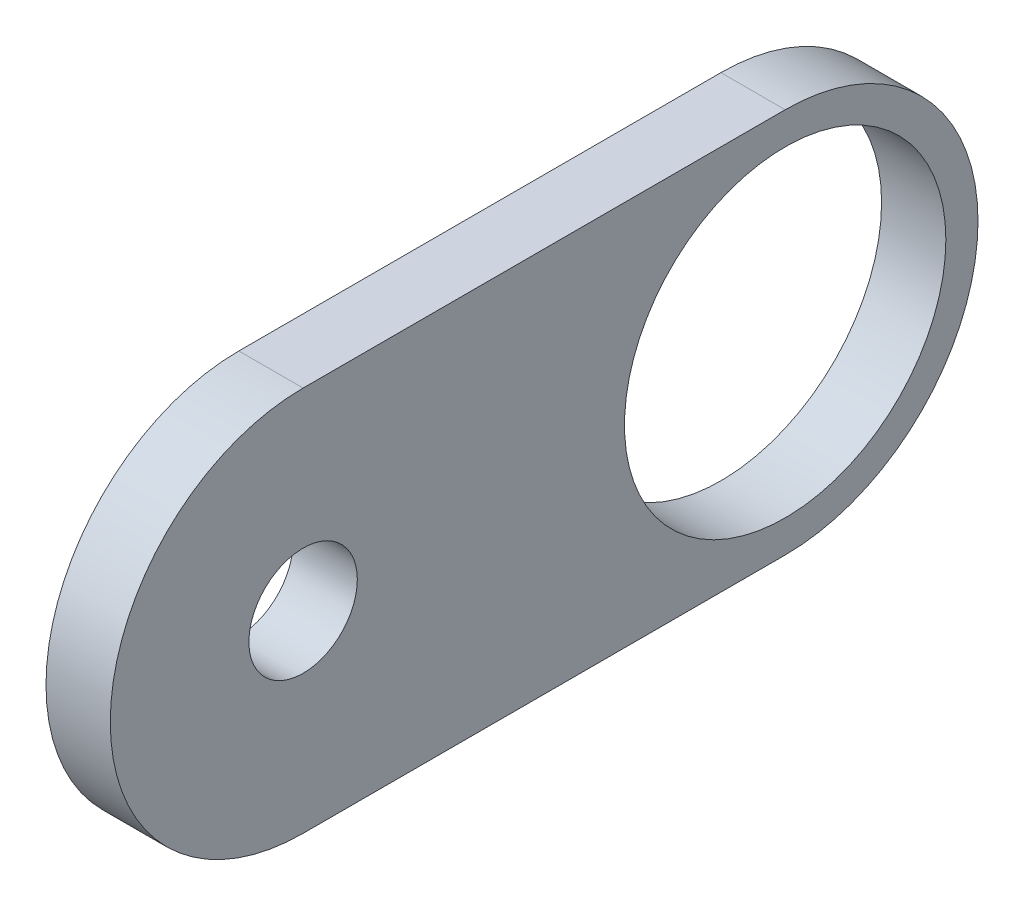
ISO-10303-21;
HEADER;
FILE_DESCRIPTION(('STEP AP214'),'2;1');
FILE_NAME('part.step','',(''),(''),'','','');
FILE_SCHEMA(('AUTOMOTIVE_DESIGN { 1 0 10303 214 1 1 1 1 }'));
ENDSEC;
DATA;
#1=APPLICATION_CONTEXT('core data for automotive mechanical design processes');
#2=APPLICATION_PROTOCOL_DEFINITION('international standard','automotive_design',2000,#1);
#3=PRODUCT_CONTEXT('',#1,'mechanical');
#4=PRODUCT('Part','Part','',(#3));
#5=PRODUCT_RELATED_PRODUCT_CATEGORY('part','',(#4));
#6=PRODUCT_DEFINITION_FORMATION('','',#4);
#7=PRODUCT_DEFINITION_CONTEXT('part definition',#1,'design');
#8=PRODUCT_DEFINITION('design','',#6,#7);
#9=PRODUCT_DEFINITION_SHAPE('','',#8);
#10=(LENGTH_UNIT() NAMED_UNIT(*) SI_UNIT(.MILLI.,.METRE.));
#11=(NAMED_UNIT(*) PLANE_ANGLE_UNIT() SI_UNIT($,.RADIAN.));
#12=(NAMED_UNIT(*) SI_UNIT($,.STERADIAN.) SOLID_ANGLE_UNIT());
#13=UNCERTAINTY_MEASURE_WITH_UNIT(LENGTH_MEASURE(1.E-05),#10,'distance_accuracy_value','');
#14=(GEOMETRIC_REPRESENTATION_CONTEXT(3) GLOBAL_UNCERTAINTY_ASSIGNED_CONTEXT((#13)) GLOBAL_UNIT_ASSIGNED_CONTEXT((#10,
#11,#12)) REPRESENTATION_CONTEXT('',''));
#15=CARTESIAN_POINT('',(0.,0.,0.));
#16=DIRECTION('',(0.,0.,1.));
#17=DIRECTION('',(1.,0.,0.));
#18=AXIS2_PLACEMENT_3D('',#15,#16,#17);
#19=CARTESIAN_POINT('',(5.0799999746,-45.6336193705345,15.3619127645357));
#20=DIRECTION('',(-1.,0.,0.));
#21=DIRECTION('',(0.,0.,1.));
#22=AXIS2_PLACEMENT_3D('',#19,#20,#21);
#23=PLANE('',#22);
#24=CARTESIAN_POINT('',(5.0799999746,-45.6336193705345,15.3619127645357));
#25=DIRECTION('',(1.,0.,0.));
#26=DIRECTION('',(0.,0.,1.));
#27=AXIS2_PLACEMENT_3D('',#24,#25,#26);
#28=CIRCLE('',#27,15.24);
#29=CARTESIAN_POINT('',(5.0799999746,-30.3936193705345,15.3619127645357));
#30=VERTEX_POINT('',#29);
#31=CARTESIAN_POINT('',(5.0799999746,-60.8736193705345,15.3619127645357));
#32=VERTEX_POINT('',#31);
#33=EDGE_CURVE('E91',#30,#32,#28,.T.);
#34=ORIENTED_EDGE('',*,*,#33,.T.);
#35=DIRECTION('',(0.,0.,-1.));
#36=VECTOR('',#35,1.);
#37=CARTESIAN_POINT('',(5.0799999746,-60.8736193705345,15.3619127645357));
#38=LINE('',#37,#36);
#39=CARTESIAN_POINT('',(5.0799999746,-60.8736193705345,-22.7380872354643));
#40=VERTEX_POINT('',#39);
#41=EDGE_CURVE('E86',#32,#40,#38,.T.);
#42=ORIENTED_EDGE('',*,*,#41,.T.);
#43=CARTESIAN_POINT('',(5.0799999746,-45.6336193705345,-22.7380872354643));
#44=DIRECTION('',(1.,0.,0.));
#45=DIRECTION('',(0.,0.,-1.));
#46=AXIS2_PLACEMENT_3D('',#43,#44,#45);
#47=CIRCLE('',#46,15.24);
#48=CARTESIAN_POINT('',(5.0799999746,-30.3936193705345,-22.7380872354643));
#49=VERTEX_POINT('',#48);
#50=EDGE_CURVE('E87',#40,#49,#47,.T.);
#51=ORIENTED_EDGE('',*,*,#50,.T.);
#52=DIRECTION('',(0.,0.,1.));
#53=VECTOR('',#52,1.);
#54=CARTESIAN_POINT('',(5.0799999746,-30.3936193705345,-22.7380872354643));
#55=LINE('',#54,#53);
#56=EDGE_CURVE('E57',#49,#30,#55,.T.);
#57=ORIENTED_EDGE('',*,*,#56,.T.);
#58=EDGE_LOOP('',(#34,#42,#51,#57));
#59=FACE_BOUND('',#58,.T.);
#60=CARTESIAN_POINT('',(5.0799999746,-45.6336193705345,-22.7380872354643));
#61=DIRECTION('',(1.,0.,0.));
#62=DIRECTION('',(0.,0.,-1.));
#63=AXIS2_PLACEMENT_3D('',#60,#61,#62);
#64=CIRCLE('',#63,12.7);
#65=CARTESIAN_POINT('',(5.0799999746,-45.6336193705345,-35.4380872354643));
#66=VERTEX_POINT('',#65);
#67=EDGE_CURVE('E107',#66,#66,#64,.T.);
#68=ORIENTED_EDGE('',*,*,#67,.F.);
#69=EDGE_LOOP('',(#68));
#70=FACE_BOUND('',#69,.T.);
#71=CARTESIAN_POINT('',(5.0799999746,-45.6336193705345,15.3619127645357));
#72=DIRECTION('',(1.,0.,0.));
#73=DIRECTION('',(0.,0.,-1.));
#74=AXIS2_PLACEMENT_3D('',#71,#72,#73);
#75=CIRCLE('',#74,4.28498);
#76=CARTESIAN_POINT('',(5.0799999746,-45.6336193705345,11.0769327645357));
#77=VERTEX_POINT('',#76);
#78=EDGE_CURVE('E123',#77,#77,#75,.T.);
#79=ORIENTED_EDGE('',*,*,#78,.F.);
#80=EDGE_LOOP('',(#79));
#81=FACE_BOUND('',#80,.T.);
#82=ADVANCED_FACE('F39',(#59,#70,#81),#23,.F.);
#83=CARTESIAN_POINT('',(0.,-45.6336193705345,15.3619127645357));
#84=DIRECTION('',(-1.,0.,0.));
#85=DIRECTION('',(0.,0.,1.));
#86=AXIS2_PLACEMENT_3D('',#83,#84,#85);
#87=PLANE('',#86);
#88=CARTESIAN_POINT('',(0.,-45.6336193705345,-22.7380872354643));
#89=DIRECTION('',(1.,0.,0.));
#90=DIRECTION('',(0.,0.,-1.));
#91=AXIS2_PLACEMENT_3D('',#88,#89,#90);
#92=CIRCLE('',#91,12.7);
#93=CARTESIAN_POINT('',(0.,-45.6336193705345,-35.4380872354643));
#94=VERTEX_POINT('',#93);
#95=EDGE_CURVE('E118',#94,#94,#92,.T.);
#96=ORIENTED_EDGE('',*,*,#95,.T.);
#97=EDGE_LOOP('',(#96));
#98=FACE_BOUND('',#97,.T.);
#99=CARTESIAN_POINT('',(0.,-45.6336193705345,15.3619127645357));
#100=DIRECTION('',(1.,0.,0.));
#101=DIRECTION('',(0.,0.,1.));
#102=AXIS2_PLACEMENT_3D('',#99,#100,#101);
#103=CIRCLE('',#102,15.24);
#104=CARTESIAN_POINT('',(0.,-30.3936193705345,15.3619127645357));
#105=VERTEX_POINT('',#104);
#106=CARTESIAN_POINT('',(0.,-60.8736193705345,15.3619127645357));
#107=VERTEX_POINT('',#106);
#108=EDGE_CURVE('E104',#105,#107,#103,.T.);
#109=ORIENTED_EDGE('',*,*,#108,.F.);
#110=DIRECTION('',(0.,0.,1.));
#111=VECTOR('',#110,1.);
#112=CARTESIAN_POINT('',(0.,-30.3936193705345,-22.7380872354643));
#113=LINE('',#112,#111);
#114=CARTESIAN_POINT('',(0.,-30.3936193705345,-22.7380872354643));
#115=VERTEX_POINT('',#114);
#116=EDGE_CURVE('E80',#115,#105,#113,.T.);
#117=ORIENTED_EDGE('',*,*,#116,.F.);
#118=CARTESIAN_POINT('',(0.,-45.6336193705345,-22.7380872354643));
#119=DIRECTION('',(1.,0.,0.));
#120=DIRECTION('',(0.,0.,-1.));
#121=AXIS2_PLACEMENT_3D('',#118,#119,#120);
#122=CIRCLE('',#121,15.24);
#123=CARTESIAN_POINT('',(0.,-60.8736193705345,-22.7380872354643));
#124=VERTEX_POINT('',#123);
#125=EDGE_CURVE('E73',#124,#115,#122,.T.);
#126=ORIENTED_EDGE('',*,*,#125,.F.);
#127=DIRECTION('',(0.,0.,-1.));
#128=VECTOR('',#127,1.);
#129=CARTESIAN_POINT('',(0.,-60.8736193705345,15.3619127645357));
#130=LINE('',#129,#128);
#131=EDGE_CURVE('E94',#107,#124,#130,.T.);
#132=ORIENTED_EDGE('',*,*,#131,.F.);
#133=EDGE_LOOP('',(#109,#117,#126,#132));
#134=FACE_BOUND('',#133,.T.);
#135=CARTESIAN_POINT('',(0.,-45.6336193705345,15.3619127645357));
#136=DIRECTION('',(1.,0.,0.));
#137=DIRECTION('',(0.,0.,-1.));
#138=AXIS2_PLACEMENT_3D('',#135,#136,#137);
#139=CIRCLE('',#138,4.28498);
#140=CARTESIAN_POINT('',(0.,-45.6336193705345,11.0769327645357));
#141=VERTEX_POINT('',#140);
#142=EDGE_CURVE('E125',#141,#141,#139,.T.);
#143=ORIENTED_EDGE('',*,*,#142,.T.);
#144=EDGE_LOOP('',(#143));
#145=FACE_BOUND('',#144,.T.);
#146=ADVANCED_FACE('F114',(#98,#134,#145),#87,.T.);
#147=CARTESIAN_POINT('',(5.0799999746,-45.6336193705345,15.3619127645357));
#148=DIRECTION('',(-1.,0.,0.));
#149=DIRECTION('',(0.,0.,1.));
#150=AXIS2_PLACEMENT_3D('',#147,#148,#149);
#151=CYLINDRICAL_SURFACE('',#150,15.24);
#152=ORIENTED_EDGE('',*,*,#108,.T.);
#153=DIRECTION('',(-1.,0.,0.));
#154=VECTOR('',#153,1.);
#155=CARTESIAN_POINT('',(5.0799999746,-60.8736193705345,15.3619127645357));
#156=LINE('',#155,#154);
#157=EDGE_CURVE('E11',#32,#107,#156,.T.);
#158=ORIENTED_EDGE('',*,*,#157,.F.);
#159=ORIENTED_EDGE('',*,*,#33,.F.);
#160=DIRECTION('',(-1.,0.,0.));
#161=VECTOR('',#160,1.);
#162=CARTESIAN_POINT('',(5.0799999746,-30.3936193705345,15.3619127645357));
#163=LINE('',#162,#161);
#164=EDGE_CURVE('E98',#30,#105,#163,.T.);
#165=ORIENTED_EDGE('',*,*,#164,.T.);
#166=EDGE_LOOP('',(#152,#158,#159,#165));
#167=FACE_BOUND('',#166,.T.);
#168=ADVANCED_FACE('F41',(#167),#151,.T.);
#169=CARTESIAN_POINT('',(5.0799999746,-60.8736193705345,15.3619127645357));
#170=DIRECTION('',(0.,1.,0.));
#171=DIRECTION('',(0.,0.,1.));
#172=AXIS2_PLACEMENT_3D('',#169,#170,#171);
#173=PLANE('',#172);
#174=ORIENTED_EDGE('',*,*,#131,.T.);
#175=DIRECTION('',(-1.,0.,0.));
#176=VECTOR('',#175,1.);
#177=CARTESIAN_POINT('',(5.0799999746,-60.8736193705345,-22.7380872354643));
#178=LINE('',#177,#176);
#179=EDGE_CURVE('E48',#40,#124,#178,.T.);
#180=ORIENTED_EDGE('',*,*,#179,.F.);
#181=ORIENTED_EDGE('',*,*,#41,.F.);
#182=ORIENTED_EDGE('',*,*,#157,.T.);
#183=EDGE_LOOP('',(#174,#180,#181,#182));
#184=FACE_BOUND('',#183,.T.);
#185=ADVANCED_FACE('F92',(#184),#173,.F.);
#186=CARTESIAN_POINT('',(5.0799999746,-45.6336193705345,-22.7380872354643));
#187=DIRECTION('',(-1.,0.,0.));
#188=DIRECTION('',(0.,0.,1.));
#189=AXIS2_PLACEMENT_3D('',#186,#187,#188);
#190=CYLINDRICAL_SURFACE('',#189,15.24);
#191=ORIENTED_EDGE('',*,*,#125,.T.);
#192=DIRECTION('',(-1.,0.,0.));
#193=VECTOR('',#192,1.);
#194=CARTESIAN_POINT('',(5.0799999746,-30.3936193705345,-22.7380872354643));
#195=LINE('',#194,#193);
#196=EDGE_CURVE('E96',#49,#115,#195,.T.);
#197=ORIENTED_EDGE('',*,*,#196,.F.);
#198=ORIENTED_EDGE('',*,*,#50,.F.);
#199=ORIENTED_EDGE('',*,*,#179,.T.);
#200=EDGE_LOOP('',(#191,#197,#198,#199));
#201=FACE_BOUND('',#200,.T.);
#202=ADVANCED_FACE('F100',(#201),#190,.T.);
#203=CARTESIAN_POINT('',(5.0799999746,-30.3936193705345,-22.7380872354643));
#204=DIRECTION('',(0.,-1.,0.));
#205=DIRECTION('',(0.,0.,-1.));
#206=AXIS2_PLACEMENT_3D('',#203,#204,#205);
#207=PLANE('',#206);
#208=ORIENTED_EDGE('',*,*,#116,.T.);
#209=ORIENTED_EDGE('',*,*,#164,.F.);
#210=ORIENTED_EDGE('',*,*,#56,.F.);
#211=ORIENTED_EDGE('',*,*,#196,.T.);
#212=EDGE_LOOP('',(#208,#209,#210,#211));
#213=FACE_BOUND('',#212,.T.);
#214=ADVANCED_FACE('F112',(#213),#207,.F.);
#215=CARTESIAN_POINT('',(5.0799999746,-45.6336193705345,-22.7380872354643));
#216=DIRECTION('',(-1.,0.,0.));
#217=DIRECTION('',(0.,0.,1.));
#218=AXIS2_PLACEMENT_3D('',#215,#216,#217);
#219=CYLINDRICAL_SURFACE('',#218,12.7);
#220=ORIENTED_EDGE('',*,*,#67,.T.);
#221=EDGE_LOOP('',(#220));
#222=FACE_BOUND('',#221,.T.);
#223=ORIENTED_EDGE('',*,*,#95,.F.);
#224=EDGE_LOOP('',(#223));
#225=FACE_BOUND('',#224,.T.);
#226=ADVANCED_FACE('F141',(#222,#225),#219,.F.);
#227=CARTESIAN_POINT('',(5.0799999746,-45.6336193705345,15.3619127645357));
#228=DIRECTION('',(-1.,0.,0.));
#229=DIRECTION('',(0.,0.,1.));
#230=AXIS2_PLACEMENT_3D('',#227,#228,#229);
#231=CYLINDRICAL_SURFACE('',#230,4.28498);
#232=ORIENTED_EDGE('',*,*,#78,.T.);
#233=EDGE_LOOP('',(#232));
#234=FACE_BOUND('',#233,.T.);
#235=ORIENTED_EDGE('',*,*,#142,.F.);
#236=EDGE_LOOP('',(#235));
#237=FACE_BOUND('',#236,.T.);
#238=ADVANCED_FACE('F127',(#234,#237),#231,.F.);
#239=CLOSED_SHELL('',(#82,#146,#168,#185,#202,#214,#226,#238));
#240=MANIFOLD_SOLID_BREP('B2',#239);
#241=ADVANCED_BREP_SHAPE_REPRESENTATION('',(#18,#240),#14);
#242=SHAPE_DEFINITION_REPRESENTATION(#9,#241);
ENDSEC;
END-ISO-10303-21;
